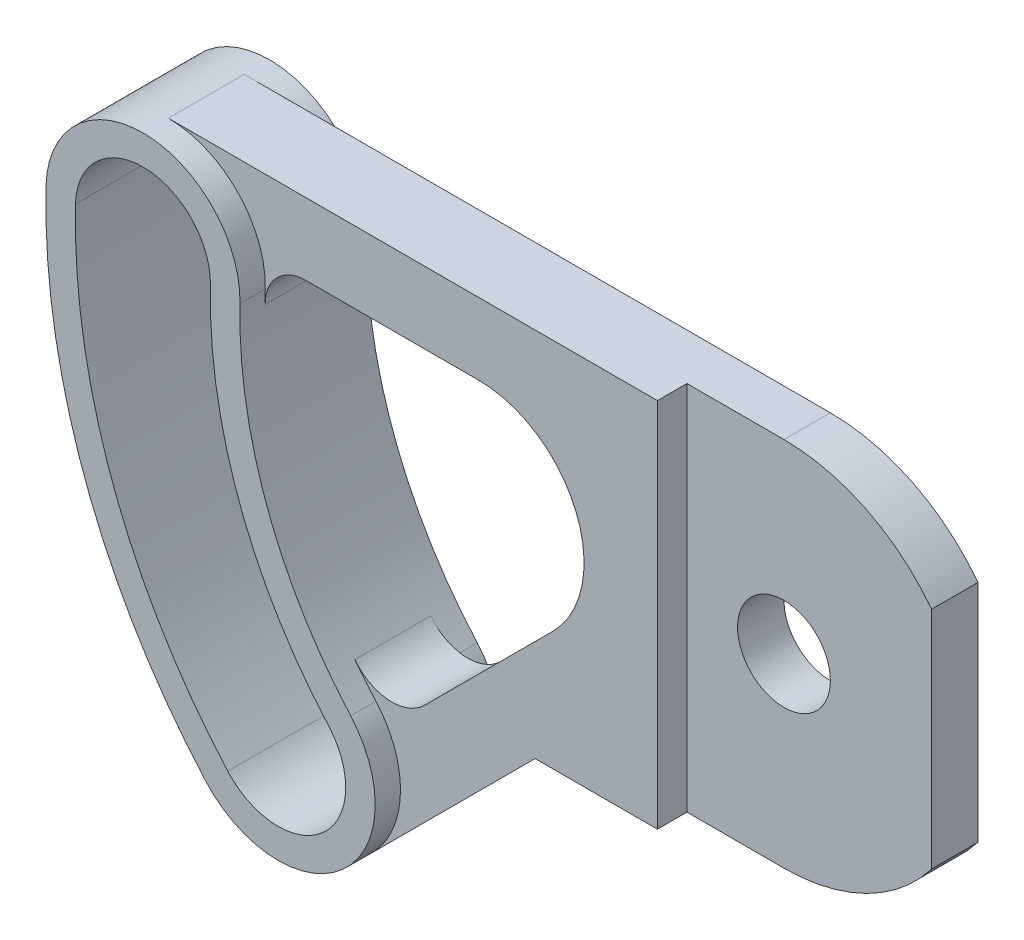
ISO-10303-21;
HEADER;
FILE_DESCRIPTION(('STEP AP214'),'2;1');
FILE_NAME('part.step','',(''),(''),'','','');
FILE_SCHEMA(('AUTOMOTIVE_DESIGN { 1 0 10303 214 1 1 1 1 }'));
ENDSEC;
DATA;
#1=APPLICATION_CONTEXT('core data for automotive mechanical design processes');
#2=APPLICATION_PROTOCOL_DEFINITION('international standard','automotive_design',2000,#1);
#3=PRODUCT_CONTEXT('',#1,'mechanical');
#4=PRODUCT('Part','Part','',(#3));
#5=PRODUCT_RELATED_PRODUCT_CATEGORY('part','',(#4));
#6=PRODUCT_DEFINITION_FORMATION('','',#4);
#7=PRODUCT_DEFINITION_CONTEXT('part definition',#1,'design');
#8=PRODUCT_DEFINITION('design','',#6,#7);
#9=PRODUCT_DEFINITION_SHAPE('','',#8);
#10=(LENGTH_UNIT() NAMED_UNIT(*) SI_UNIT(.MILLI.,.METRE.));
#11=(NAMED_UNIT(*) PLANE_ANGLE_UNIT() SI_UNIT($,.RADIAN.));
#12=(NAMED_UNIT(*) SI_UNIT($,.STERADIAN.) SOLID_ANGLE_UNIT());
#13=UNCERTAINTY_MEASURE_WITH_UNIT(LENGTH_MEASURE(1.E-05),#10,'distance_accuracy_value','');
#14=(GEOMETRIC_REPRESENTATION_CONTEXT(3) GLOBAL_UNCERTAINTY_ASSIGNED_CONTEXT((#13)) GLOBAL_UNIT_ASSIGNED_CONTEXT((#10,
#11,#12)) REPRESENTATION_CONTEXT('',''));
#15=CARTESIAN_POINT('',(0.,0.,0.));
#16=DIRECTION('',(0.,0.,1.));
#17=DIRECTION('',(1.,0.,0.));
#18=AXIS2_PLACEMENT_3D('',#15,#16,#17);
#19=CARTESIAN_POINT('',(-12.,18.,15.));
#20=DIRECTION('',(0.,0.,-1.));
#21=DIRECTION('',(-1.,0.,0.));
#22=AXIS2_PLACEMENT_3D('',#19,#20,#21);
#23=CYLINDRICAL_SURFACE('',#22,150.);
#24=CARTESIAN_POINT('',(-12.,18.,-15.));
#25=DIRECTION('',(0.,0.,1.));
#26=DIRECTION('',(1.,0.,0.));
#27=AXIS2_PLACEMENT_3D('',#24,#25,#26);
#28=CIRCLE('',#27,150.);
#29=CARTESIAN_POINT('',(-161.958144076572,21.5433070866142,-15.));
#30=VERTEX_POINT('',#29);
#31=CARTESIAN_POINT('',(-124.100356479706,-81.6669959270512,-15.));
#32=VERTEX_POINT('',#31);
#33=EDGE_CURVE('E382',#30,#32,#28,.T.);
#34=ORIENTED_EDGE('',*,*,#33,.T.);
#35=DIRECTION('',(0.,0.,-1.));
#36=VECTOR('',#35,1.);
#37=CARTESIAN_POINT('',(-124.100356479706,-81.6669959270512,15.));
#38=LINE('',#37,#36);
#39=CARTESIAN_POINT('',(-124.100356479706,-81.6669959270512,15.));
#40=VERTEX_POINT('',#39);
#41=EDGE_CURVE('E11',#40,#32,#38,.T.);
#42=ORIENTED_EDGE('',*,*,#41,.F.);
#43=CARTESIAN_POINT('',(-12.,18.,15.));
#44=DIRECTION('',(0.,0.,1.));
#45=DIRECTION('',(1.,0.,0.));
#46=AXIS2_PLACEMENT_3D('',#43,#44,#45);
#47=CIRCLE('',#46,150.);
#48=CARTESIAN_POINT('',(-161.958144076572,21.5433070866142,15.));
#49=VERTEX_POINT('',#48);
#50=EDGE_CURVE('E363',#49,#40,#47,.T.);
#51=ORIENTED_EDGE('',*,*,#50,.F.);
#52=DIRECTION('',(0.,0.,-1.));
#53=VECTOR('',#52,1.);
#54=CARTESIAN_POINT('',(-161.958144076572,21.5433070866142,15.));
#55=LINE('',#54,#53);
#56=EDGE_CURVE('E394',#49,#30,#55,.T.);
#57=ORIENTED_EDGE('',*,*,#56,.T.);
#58=EDGE_LOOP('',(#34,#42,#51,#57));
#59=FACE_BOUND('',#58,.T.);
#60=ADVANCED_FACE('F39',(#59),#23,.T.);
#61=CARTESIAN_POINT('',(-106.911635152818,-66.3847232182367,15.));
#62=DIRECTION('',(0.,0.,-1.));
#63=DIRECTION('',(-1.,0.,0.));
#64=AXIS2_PLACEMENT_3D('',#61,#62,#63);
#65=CYLINDRICAL_SURFACE('',#64,23.);
#66=DIRECTION('',(0.,0.,-1.));
#67=VECTOR('',#66,1.);
#68=CARTESIAN_POINT('',(-90.6481791855271,-82.6481791855273,9.));
#69=LINE('',#68,#67);
#70=CARTESIAN_POINT('',(-90.6481791855271,-82.6481791855273,9.));
#71=VERTEX_POINT('',#70);
#72=CARTESIAN_POINT('',(-90.6481791855271,-82.6481791855273,-9.));
#73=VERTEX_POINT('',#72);
#74=EDGE_CURVE('E338',#71,#73,#69,.T.);
#75=ORIENTED_EDGE('',*,*,#74,.F.);
#76=CARTESIAN_POINT('',(-106.911635152818,-66.3847232182367,9.));
#77=DIRECTION('',(0.,0.,1.));
#78=DIRECTION('',(1.,0.,0.));
#79=AXIS2_PLACEMENT_3D('',#76,#77,#78);
#80=CIRCLE('',#79,23.);
#81=CARTESIAN_POINT('',(-89.7229138259295,-51.1024505094222,9.));
#82=VERTEX_POINT('',#81);
#83=EDGE_CURVE('E267',#71,#82,#80,.T.);
#84=ORIENTED_EDGE('',*,*,#83,.T.);
#85=DIRECTION('',(0.,0.,-1.));
#86=VECTOR('',#85,1.);
#87=CARTESIAN_POINT('',(-89.7229138259295,-51.1024505094222,15.));
#88=LINE('',#87,#86);
#89=CARTESIAN_POINT('',(-89.7229138259295,-51.1024505094222,15.));
#90=VERTEX_POINT('',#89);
#91=EDGE_CURVE('E48',#90,#82,#88,.T.);
#92=ORIENTED_EDGE('',*,*,#91,.F.);
#93=CARTESIAN_POINT('',(-106.911635152818,-66.3847232182367,15.));
#94=DIRECTION('',(0.,0.,1.));
#95=DIRECTION('',(1.,0.,0.));
#96=AXIS2_PLACEMENT_3D('',#93,#94,#95);
#97=CIRCLE('',#96,23.);
#98=EDGE_CURVE('E365',#40,#90,#97,.T.);
#99=ORIENTED_EDGE('',*,*,#98,.F.);
#100=ORIENTED_EDGE('',*,*,#41,.T.);
#101=CARTESIAN_POINT('',(-106.911635152818,-66.3847232182367,-15.));
#102=DIRECTION('',(0.,0.,1.));
#103=DIRECTION('',(1.,0.,0.));
#104=AXIS2_PLACEMENT_3D('',#101,#102,#103);
#105=CIRCLE('',#104,23.);
#106=CARTESIAN_POINT('',(-89.7229138259295,-51.1024505094222,-15.));
#107=VERTEX_POINT('',#106);
#108=EDGE_CURVE('E387',#32,#107,#105,.T.);
#109=ORIENTED_EDGE('',*,*,#108,.T.);
#110=CARTESIAN_POINT('',(-89.7229138259295,-51.1024505094222,-9.));
#111=VERTEX_POINT('',#110);
#112=EDGE_CURVE('E398',#111,#107,#88,.T.);
#113=ORIENTED_EDGE('',*,*,#112,.F.);
#114=CARTESIAN_POINT('',(-106.911635152818,-66.3847232182367,-9.));
#115=DIRECTION('',(0.,0.,1.));
#116=DIRECTION('',(1.,0.,0.));
#117=AXIS2_PLACEMENT_3D('',#114,#115,#116);
#118=CIRCLE('',#117,23.);
#119=EDGE_CURVE('E304',#73,#111,#118,.T.);
#120=ORIENTED_EDGE('',*,*,#119,.F.);
#121=EDGE_LOOP('',(#75,#84,#92,#99,#100,#109,#113,#120));
#122=FACE_BOUND('',#121,.T.);
#123=ADVANCED_FACE('F432',(#122),#65,.T.);
#124=CARTESIAN_POINT('',(-12.,18.,15.));
#125=DIRECTION('',(0.,0.,-1.));
#126=DIRECTION('',(-1.,0.,0.));
#127=AXIS2_PLACEMENT_3D('',#124,#125,#126);
#128=CYLINDRICAL_SURFACE('',#127,104.);
#129=CARTESIAN_POINT('',(-12.,18.,9.));
#130=DIRECTION('',(0.,0.,1.));
#131=DIRECTION('',(1.,0.,0.));
#132=AXIS2_PLACEMENT_3D('',#129,#130,#131);
#133=CIRCLE('',#132,104.);
#134=CARTESIAN_POINT('',(-115.97097989309,20.4566929133858,9.));
#135=VERTEX_POINT('',#134);
#136=CARTESIAN_POINT('',(-115.997334395089,17.2553935831425,9.));
#137=VERTEX_POINT('',#136);
#138=EDGE_CURVE('E269',#135,#137,#133,.T.);
#139=ORIENTED_EDGE('',*,*,#138,.F.);
#140=DIRECTION('',(0.,0.,-1.));
#141=VECTOR('',#140,1.);
#142=CARTESIAN_POINT('',(-115.97097989309,20.4566929133858,15.));
#143=LINE('',#142,#141);
#144=CARTESIAN_POINT('',(-115.97097989309,20.4566929133858,15.));
#145=VERTEX_POINT('',#144);
#146=EDGE_CURVE('E400',#145,#135,#143,.T.);
#147=ORIENTED_EDGE('',*,*,#146,.F.);
#148=CARTESIAN_POINT('',(-12.,18.,15.));
#149=DIRECTION('',(0.,0.,1.));
#150=DIRECTION('',(1.,0.,0.));
#151=AXIS2_PLACEMENT_3D('',#148,#149,#150);
#152=CIRCLE('',#151,104.);
#153=EDGE_CURVE('E368',#145,#90,#152,.T.);
#154=ORIENTED_EDGE('',*,*,#153,.T.);
#155=ORIENTED_EDGE('',*,*,#91,.T.);
#156=CARTESIAN_POINT('',(-94.7175715607181,-45.0381103388853,9.));
#157=VERTEX_POINT('',#156);
#158=EDGE_CURVE('E270',#157,#82,#133,.T.);
#159=ORIENTED_EDGE('',*,*,#158,.F.);
#160=DIRECTION('',(0.,0.,-1.));
#161=VECTOR('',#160,1.);
#162=CARTESIAN_POINT('',(-94.7175715607181,-45.0381103388853,9.));
#163=LINE('',#162,#161);
#164=CARTESIAN_POINT('',(-94.7175715607181,-45.0381103388853,-9.));
#165=VERTEX_POINT('',#164);
#166=EDGE_CURVE('E345',#157,#165,#163,.T.);
#167=ORIENTED_EDGE('',*,*,#166,.T.);
#168=CARTESIAN_POINT('',(-12.,18.,-9.));
#169=DIRECTION('',(0.,0.,1.));
#170=DIRECTION('',(1.,0.,0.));
#171=AXIS2_PLACEMENT_3D('',#168,#169,#170);
#172=CIRCLE('',#171,104.);
#173=EDGE_CURVE('E298',#165,#111,#172,.T.);
#174=ORIENTED_EDGE('',*,*,#173,.T.);
#175=ORIENTED_EDGE('',*,*,#112,.T.);
#176=CARTESIAN_POINT('',(-12.,18.,-15.));
#177=DIRECTION('',(0.,0.,1.));
#178=DIRECTION('',(1.,0.,0.));
#179=AXIS2_PLACEMENT_3D('',#176,#177,#178);
#180=CIRCLE('',#179,104.);
#181=CARTESIAN_POINT('',(-115.97097989309,20.4566929133858,-15.));
#182=VERTEX_POINT('',#181);
#183=EDGE_CURVE('E386',#182,#107,#180,.T.);
#184=ORIENTED_EDGE('',*,*,#183,.F.);
#185=CARTESIAN_POINT('',(-115.97097989309,20.4566929133858,-9.));
#186=VERTEX_POINT('',#185);
#187=EDGE_CURVE('E397',#186,#182,#143,.T.);
#188=ORIENTED_EDGE('',*,*,#187,.F.);
#189=CARTESIAN_POINT('',(-115.997334395089,17.2553935831425,-9.));
#190=VERTEX_POINT('',#189);
#191=EDGE_CURVE('E301',#186,#190,#172,.T.);
#192=ORIENTED_EDGE('',*,*,#191,.T.);
#193=DIRECTION('',(0.,0.,-1.));
#194=VECTOR('',#193,1.);
#195=CARTESIAN_POINT('',(-115.997334395089,17.2553935831425,9.));
#196=LINE('',#195,#194);
#197=EDGE_CURVE('E61',#137,#190,#196,.T.);
#198=ORIENTED_EDGE('',*,*,#197,.F.);
#199=EDGE_LOOP('',(#139,#147,#154,#155,#159,#167,#174,#175,#184,#188,#192,#198));
#200=FACE_BOUND('',#199,.T.);
#201=ADVANCED_FACE('F442',(#200),#128,.F.);
#202=CARTESIAN_POINT('',(-138.964561984831,21.,15.));
#203=DIRECTION('',(0.,0.,-1.));
#204=DIRECTION('',(-1.,0.,0.));
#205=AXIS2_PLACEMENT_3D('',#202,#203,#204);
#206=CYLINDRICAL_SURFACE('',#205,16.);
#207=CARTESIAN_POINT('',(-138.964561984831,21.,-15.));
#208=DIRECTION('',(0.,0.,1.));
#209=DIRECTION('',(1.,0.,0.));
#210=AXIS2_PLACEMENT_3D('',#207,#208,#209);
#211=CIRCLE('',#210,16.);
#212=CARTESIAN_POINT('',(-122.969026616663,20.6220472440945,-15.));
#213=VERTEX_POINT('',#212);
#214=CARTESIAN_POINT('',(-154.960097352999,21.3779527559055,-15.));
#215=VERTEX_POINT('',#214);
#216=EDGE_CURVE('E346',#213,#215,#211,.T.);
#217=ORIENTED_EDGE('',*,*,#216,.F.);
#218=DIRECTION('',(0.,0.,-1.));
#219=VECTOR('',#218,1.);
#220=CARTESIAN_POINT('',(-122.969026616663,20.6220472440945,15.));
#221=LINE('',#220,#219);
#222=CARTESIAN_POINT('',(-122.969026616663,20.6220472440945,15.));
#223=VERTEX_POINT('',#222);
#224=EDGE_CURVE('E43',#223,#213,#221,.T.);
#225=ORIENTED_EDGE('',*,*,#224,.F.);
#226=CARTESIAN_POINT('',(-138.964561984831,21.,15.));
#227=DIRECTION('',(0.,0.,1.));
#228=DIRECTION('',(1.,0.,0.));
#229=AXIS2_PLACEMENT_3D('',#226,#227,#228);
#230=CIRCLE('',#229,16.);
#231=CARTESIAN_POINT('',(-154.960097352999,21.3779527559055,15.));
#232=VERTEX_POINT('',#231);
#233=EDGE_CURVE('E349',#223,#232,#230,.T.);
#234=ORIENTED_EDGE('',*,*,#233,.T.);
#235=DIRECTION('',(0.,0.,-1.));
#236=VECTOR('',#235,1.);
#237=CARTESIAN_POINT('',(-154.960097352999,21.3779527559055,15.));
#238=LINE('',#237,#236);
#239=EDGE_CURVE('E371',#232,#215,#238,.T.);
#240=ORIENTED_EDGE('',*,*,#239,.T.);
#241=EDGE_LOOP('',(#217,#225,#234,#240));
#242=FACE_BOUND('',#241,.T.);
#243=ADVANCED_FACE('F41',(#242),#206,.F.);
#244=CARTESIAN_POINT('',(-12.,18.,15.));
#245=DIRECTION('',(0.,0.,-1.));
#246=DIRECTION('',(-1.,0.,0.));
#247=AXIS2_PLACEMENT_3D('',#244,#245,#246);
#248=CYLINDRICAL_SURFACE('',#247,111.);
#249=CARTESIAN_POINT('',(-12.,18.,-15.));
#250=DIRECTION('',(0.,0.,1.));
#251=DIRECTION('',(1.,0.,0.));
#252=AXIS2_PLACEMENT_3D('',#249,#250,#251);
#253=CIRCLE('',#252,111.);
#254=CARTESIAN_POINT('',(-94.9542637949824,-55.7535769860179,-15.));
#255=VERTEX_POINT('',#254);
#256=EDGE_CURVE('E372',#213,#255,#253,.T.);
#257=ORIENTED_EDGE('',*,*,#256,.T.);
#258=DIRECTION('',(0.,0.,-1.));
#259=VECTOR('',#258,1.);
#260=CARTESIAN_POINT('',(-94.9542637949824,-55.7535769860179,15.));
#261=LINE('',#260,#259);
#262=CARTESIAN_POINT('',(-94.9542637949824,-55.7535769860179,15.));
#263=VERTEX_POINT('',#262);
#264=EDGE_CURVE('E403',#263,#255,#261,.T.);
#265=ORIENTED_EDGE('',*,*,#264,.F.);
#266=CARTESIAN_POINT('',(-12.,18.,15.));
#267=DIRECTION('',(0.,0.,1.));
#268=DIRECTION('',(1.,0.,0.));
#269=AXIS2_PLACEMENT_3D('',#266,#267,#268);
#270=CIRCLE('',#269,111.);
#271=EDGE_CURVE('E355',#223,#263,#270,.T.);
#272=ORIENTED_EDGE('',*,*,#271,.F.);
#273=ORIENTED_EDGE('',*,*,#224,.T.);
#274=EDGE_LOOP('',(#257,#265,#272,#273));
#275=FACE_BOUND('',#274,.T.);
#276=ADVANCED_FACE('F415',(#275),#248,.T.);
#277=CARTESIAN_POINT('',(-106.911635152818,-66.3847232182367,15.));
#278=DIRECTION('',(0.,0.,-1.));
#279=DIRECTION('',(-1.,0.,0.));
#280=AXIS2_PLACEMENT_3D('',#277,#278,#279);
#281=CYLINDRICAL_SURFACE('',#280,16.);
#282=CARTESIAN_POINT('',(-106.911635152818,-66.3847232182367,-15.));
#283=DIRECTION('',(0.,0.,1.));
#284=DIRECTION('',(1.,0.,0.));
#285=AXIS2_PLACEMENT_3D('',#282,#283,#284);
#286=CIRCLE('',#285,16.);
#287=CARTESIAN_POINT('',(-118.869006510653,-77.0158694504554,-15.));
#288=VERTEX_POINT('',#287);
#289=EDGE_CURVE('E380',#288,#255,#286,.T.);
#290=ORIENTED_EDGE('',*,*,#289,.F.);
#291=DIRECTION('',(0.,0.,-1.));
#292=VECTOR('',#291,1.);
#293=CARTESIAN_POINT('',(-118.869006510653,-77.0158694504554,15.));
#294=LINE('',#293,#292);
#295=CARTESIAN_POINT('',(-118.869006510653,-77.0158694504554,15.));
#296=VERTEX_POINT('',#295);
#297=EDGE_CURVE('E404',#296,#288,#294,.T.);
#298=ORIENTED_EDGE('',*,*,#297,.F.);
#299=CARTESIAN_POINT('',(-106.911635152818,-66.3847232182367,15.));
#300=DIRECTION('',(0.,0.,1.));
#301=DIRECTION('',(1.,0.,0.));
#302=AXIS2_PLACEMENT_3D('',#299,#300,#301);
#303=CIRCLE('',#302,16.);
#304=EDGE_CURVE('E353',#296,#263,#303,.T.);
#305=ORIENTED_EDGE('',*,*,#304,.T.);
#306=ORIENTED_EDGE('',*,*,#264,.T.);
#307=EDGE_LOOP('',(#290,#298,#305,#306));
#308=FACE_BOUND('',#307,.T.);
#309=ADVANCED_FACE('F424',(#308),#281,.F.);
#310=CARTESIAN_POINT('',(-12.,18.,15.));
#311=DIRECTION('',(0.,0.,-1.));
#312=DIRECTION('',(-1.,0.,0.));
#313=AXIS2_PLACEMENT_3D('',#310,#311,#312);
#314=CYLINDRICAL_SURFACE('',#313,143.);
#315=CARTESIAN_POINT('',(-12.,18.,-15.));
#316=DIRECTION('',(0.,0.,1.));
#317=DIRECTION('',(1.,0.,0.));
#318=AXIS2_PLACEMENT_3D('',#315,#316,#317);
#319=CIRCLE('',#318,143.);
#320=EDGE_CURVE('E379',#215,#288,#319,.T.);
#321=ORIENTED_EDGE('',*,*,#320,.F.);
#322=ORIENTED_EDGE('',*,*,#239,.F.);
#323=CARTESIAN_POINT('',(-12.,18.,15.));
#324=DIRECTION('',(0.,0.,1.));
#325=DIRECTION('',(1.,0.,0.));
#326=AXIS2_PLACEMENT_3D('',#323,#324,#325);
#327=CIRCLE('',#326,143.);
#328=EDGE_CURVE('E359',#232,#296,#327,.T.);
#329=ORIENTED_EDGE('',*,*,#328,.T.);
#330=ORIENTED_EDGE('',*,*,#297,.T.);
#331=EDGE_LOOP('',(#321,#322,#329,#330));
#332=FACE_BOUND('',#331,.T.);
#333=ADVANCED_FACE('F425',(#332),#314,.F.);
#334=CARTESIAN_POINT('',(-138.964561984831,21.,15.));
#335=DIRECTION('',(0.,0.,-1.));
#336=DIRECTION('',(-1.,0.,0.));
#337=AXIS2_PLACEMENT_3D('',#334,#335,#336);
#338=CYLINDRICAL_SURFACE('',#337,23.);
#339=ORIENTED_EDGE('',*,*,#146,.T.);
#340=CARTESIAN_POINT('',(-138.964561984831,21.,9.));
#341=DIRECTION('',(0.,0.,1.));
#342=DIRECTION('',(1.,0.,0.));
#343=AXIS2_PLACEMENT_3D('',#340,#341,#342);
#344=CIRCLE('',#343,23.);
#345=CARTESIAN_POINT('',(-138.964561984831,44.,9.));
#346=VERTEX_POINT('',#345);
#347=EDGE_CURVE('E283',#135,#346,#344,.T.);
#348=ORIENTED_EDGE('',*,*,#347,.T.);
#349=DIRECTION('',(0.,0.,-1.));
#350=VECTOR('',#349,1.);
#351=CARTESIAN_POINT('',(-138.964561984831,44.,9.));
#352=LINE('',#351,#350);
#353=CARTESIAN_POINT('',(-138.964561984831,44.,-9.));
#354=VERTEX_POINT('',#353);
#355=EDGE_CURVE('E335',#346,#354,#352,.T.);
#356=ORIENTED_EDGE('',*,*,#355,.T.);
#357=CARTESIAN_POINT('',(-138.964561984831,21.,-9.));
#358=DIRECTION('',(0.,0.,1.));
#359=DIRECTION('',(1.,0.,0.));
#360=AXIS2_PLACEMENT_3D('',#357,#358,#359);
#361=CIRCLE('',#360,23.);
#362=EDGE_CURVE('E312',#186,#354,#361,.T.);
#363=ORIENTED_EDGE('',*,*,#362,.F.);
#364=ORIENTED_EDGE('',*,*,#187,.T.);
#365=CARTESIAN_POINT('',(-138.964561984831,21.,-15.));
#366=DIRECTION('',(0.,0.,1.));
#367=DIRECTION('',(1.,0.,0.));
#368=AXIS2_PLACEMENT_3D('',#365,#366,#367);
#369=CIRCLE('',#368,23.);
#370=EDGE_CURVE('E354',#182,#30,#369,.T.);
#371=ORIENTED_EDGE('',*,*,#370,.T.);
#372=ORIENTED_EDGE('',*,*,#56,.F.);
#373=CARTESIAN_POINT('',(-138.964561984831,21.,15.));
#374=DIRECTION('',(0.,0.,1.));
#375=DIRECTION('',(1.,0.,0.));
#376=AXIS2_PLACEMENT_3D('',#373,#374,#375);
#377=CIRCLE('',#376,23.);
#378=EDGE_CURVE('E369',#145,#49,#377,.T.);
#379=ORIENTED_EDGE('',*,*,#378,.F.);
#380=EDGE_LOOP('',(#339,#348,#356,#363,#364,#371,#372,#379));
#381=FACE_BOUND('',#380,.T.);
#382=ADVANCED_FACE('F431',(#381),#338,.T.);
#383=CARTESIAN_POINT('',(0.,0.,15.));
#384=DIRECTION('',(0.,0.,1.));
#385=DIRECTION('',(1.,0.,0.));
#386=AXIS2_PLACEMENT_3D('',#383,#384,#385);
#387=PLANE('',#386);
#388=ORIENTED_EDGE('',*,*,#233,.F.);
#389=ORIENTED_EDGE('',*,*,#271,.T.);
#390=ORIENTED_EDGE('',*,*,#304,.F.);
#391=ORIENTED_EDGE('',*,*,#328,.F.);
#392=EDGE_LOOP('',(#388,#389,#390,#391));
#393=FACE_BOUND('',#392,.T.);
#394=ORIENTED_EDGE('',*,*,#50,.T.);
#395=ORIENTED_EDGE('',*,*,#98,.T.);
#396=ORIENTED_EDGE('',*,*,#153,.F.);
#397=ORIENTED_EDGE('',*,*,#378,.T.);
#398=EDGE_LOOP('',(#394,#395,#396,#397));
#399=FACE_BOUND('',#398,.T.);
#400=ADVANCED_FACE('F446',(#393,#399),#387,.T.);
#401=CARTESIAN_POINT('',(0.,0.,-15.));
#402=DIRECTION('',(0.,0.,1.));
#403=DIRECTION('',(1.,0.,0.));
#404=AXIS2_PLACEMENT_3D('',#401,#402,#403);
#405=PLANE('',#404);
#406=ORIENTED_EDGE('',*,*,#216,.T.);
#407=ORIENTED_EDGE('',*,*,#320,.T.);
#408=ORIENTED_EDGE('',*,*,#289,.T.);
#409=ORIENTED_EDGE('',*,*,#256,.F.);
#410=EDGE_LOOP('',(#406,#407,#408,#409));
#411=FACE_BOUND('',#410,.T.);
#412=ORIENTED_EDGE('',*,*,#33,.F.);
#413=ORIENTED_EDGE('',*,*,#370,.F.);
#414=ORIENTED_EDGE('',*,*,#183,.T.);
#415=ORIENTED_EDGE('',*,*,#108,.F.);
#416=EDGE_LOOP('',(#412,#413,#414,#415));
#417=FACE_BOUND('',#416,.T.);
#418=ADVANCED_FACE('F417',(#411,#417),#405,.F.);
#419=CARTESIAN_POINT('',(-16.0208152801714,16.0208152801714,9.));
#420=DIRECTION('',(0.707106781186549,-0.707106781186546,0.));
#421=DIRECTION('',(0.707106781186546,0.707106781186549,0.));
#422=AXIS2_PLACEMENT_3D('',#419,#420,#421);
#423=PLANE('',#422);
#424=DIRECTION('',(-0.707106781186546,-0.707106781186549,0.));
#425=VECTOR('',#424,1.);
#426=CARTESIAN_POINT('',(-16.0208152801714,16.0208152801714,-9.));
#427=LINE('',#426,#425);
#428=CARTESIAN_POINT('',(-47.7193000900063,-15.6776695296637,-9.));
#429=VERTEX_POINT('',#428);
#430=CARTESIAN_POINT('',(-78.1904230525901,-46.1487924922476,-9.));
#431=VERTEX_POINT('',#430);
#432=EDGE_CURVE('E217',#429,#431,#427,.T.);
#433=ORIENTED_EDGE('',*,*,#432,.T.);
#434=DIRECTION('',(0.,0.,-1.));
#435=VECTOR('',#434,1.);
#436=CARTESIAN_POINT('',(-78.1904230525901,-46.1487924922476,9.));
#437=LINE('',#436,#435);
#438=CARTESIAN_POINT('',(-78.1904230525901,-46.1487924922476,9.));
#439=VERTEX_POINT('',#438);
#440=EDGE_CURVE('E343',#439,#431,#437,.T.);
#441=ORIENTED_EDGE('',*,*,#440,.F.);
#442=DIRECTION('',(-0.707106781186546,-0.707106781186549,0.));
#443=VECTOR('',#442,1.);
#444=CARTESIAN_POINT('',(-16.0208152801714,16.0208152801714,9.));
#445=LINE('',#444,#443);
#446=CARTESIAN_POINT('',(-47.7193000900063,-15.6776695296637,9.));
#447=VERTEX_POINT('',#446);
#448=EDGE_CURVE('E261',#447,#439,#445,.T.);
#449=ORIENTED_EDGE('',*,*,#448,.F.);
#450=DIRECTION('',(0.,0.,-1.));
#451=VECTOR('',#450,1.);
#452=CARTESIAN_POINT('',(-47.7193000900063,-15.6776695296637,9.));
#453=LINE('',#452,#451);
#454=EDGE_CURVE('E293',#447,#429,#453,.T.);
#455=ORIENTED_EDGE('',*,*,#454,.T.);
#456=EDGE_LOOP('',(#433,#441,#449,#455));
#457=FACE_BOUND('',#456,.T.);
#458=ADVANCED_FACE('F454',(#457),#423,.F.);
#459=CARTESIAN_POINT('',(-85.9685976456421,-38.3706178991956,9.));
#460=DIRECTION('',(0.,0.,-1.));
#461=DIRECTION('',(-1.,0.,0.));
#462=AXIS2_PLACEMENT_3D('',#459,#460,#461);
#463=CYLINDRICAL_SURFACE('',#462,11.);
#464=CARTESIAN_POINT('',(-85.9685976456421,-38.3706178991956,-9.));
#465=DIRECTION('',(0.,0.,1.));
#466=DIRECTION('',(1.,0.,0.));
#467=AXIS2_PLACEMENT_3D('',#464,#465,#466);
#468=CIRCLE('',#467,11.);
#469=EDGE_CURVE('E299',#431,#165,#468,.F.);
#470=ORIENTED_EDGE('',*,*,#469,.T.);
#471=ORIENTED_EDGE('',*,*,#166,.F.);
#472=CARTESIAN_POINT('',(-85.9685976456421,-38.3706178991956,9.));
#473=DIRECTION('',(0.,0.,1.));
#474=DIRECTION('',(1.,0.,0.));
#475=AXIS2_PLACEMENT_3D('',#472,#473,#474);
#476=CIRCLE('',#475,11.);
#477=EDGE_CURVE('E262',#439,#157,#476,.F.);
#478=ORIENTED_EDGE('',*,*,#477,.F.);
#479=ORIENTED_EDGE('',*,*,#440,.T.);
#480=EDGE_LOOP('',(#470,#471,#478,#479));
#481=FACE_BOUND('',#480,.T.);
#482=ADVANCED_FACE('F459',(#481),#463,.F.);
#483=CARTESIAN_POINT('',(-4.00000000000009,4.00000000000008,9.));
#484=DIRECTION('',(0.707106781186549,-0.707106781186546,0.));
#485=DIRECTION('',(0.707106781186546,0.707106781186549,0.));
#486=AXIS2_PLACEMENT_3D('',#483,#484,#485);
#487=PLANE('',#486);
#488=DIRECTION('',(-0.707106781186546,-0.707106781186549,0.));
#489=VECTOR('',#488,1.);
#490=CARTESIAN_POINT('',(-4.00000000000009,4.00000000000008,-9.));
#491=LINE('',#490,#489);
#492=CARTESIAN_POINT('',(-52.,-44.,-9.));
#493=VERTEX_POINT('',#492);
#494=EDGE_CURVE('E308',#493,#73,#491,.T.);
#495=ORIENTED_EDGE('',*,*,#494,.F.);
#496=DIRECTION('',(0.,0.,-1.));
#497=VECTOR('',#496,1.);
#498=CARTESIAN_POINT('',(-52.,-44.,9.));
#499=LINE('',#498,#497);
#500=CARTESIAN_POINT('',(-52.,-44.,9.));
#501=VERTEX_POINT('',#500);
#502=EDGE_CURVE('E339',#501,#493,#499,.T.);
#503=ORIENTED_EDGE('',*,*,#502,.F.);
#504=DIRECTION('',(-0.707106781186546,-0.707106781186549,0.));
#505=VECTOR('',#504,1.);
#506=CARTESIAN_POINT('',(-4.00000000000009,4.00000000000008,9.));
#507=LINE('',#506,#505);
#508=EDGE_CURVE('E272',#501,#71,#507,.T.);
#509=ORIENTED_EDGE('',*,*,#508,.T.);
#510=ORIENTED_EDGE('',*,*,#74,.T.);
#511=EDGE_LOOP('',(#495,#503,#509,#510));
#512=FACE_BOUND('',#511,.T.);
#513=ADVANCED_FACE('F464',(#512),#487,.T.);
#514=CARTESIAN_POINT('',(0.,-44.,9.));
#515=DIRECTION('',(0.,-1.,0.));
#516=DIRECTION('',(1.,0.,0.));
#517=AXIS2_PLACEMENT_3D('',#514,#515,#516);
#518=PLANE('',#517);
#519=DIRECTION('',(-1.,0.,0.));
#520=VECTOR('',#519,1.);
#521=CARTESIAN_POINT('',(0.,-44.,-9.));
#522=LINE('',#521,#520);
#523=CARTESIAN_POINT('',(0.,-44.,-9.));
#524=VERTEX_POINT('',#523);
#525=EDGE_CURVE('E310',#524,#493,#522,.T.);
#526=ORIENTED_EDGE('',*,*,#525,.F.);
#527=DIRECTION('',(0.,0.,-1.));
#528=VECTOR('',#527,1.);
#529=CARTESIAN_POINT('',(0.,-44.,2.));
#530=LINE('',#529,#528);
#531=CARTESIAN_POINT('',(0.,-44.,2.));
#532=VERTEX_POINT('',#531);
#533=EDGE_CURVE('E260',#532,#524,#530,.T.);
#534=ORIENTED_EDGE('',*,*,#533,.F.);
#535=DIRECTION('',(-1.,0.,0.));
#536=VECTOR('',#535,1.);
#537=CARTESIAN_POINT('',(0.,-44.,2.));
#538=LINE('',#537,#536);
#539=CARTESIAN_POINT('',(-23.,-44.,2.));
#540=VERTEX_POINT('',#539);
#541=EDGE_CURVE('E244',#532,#540,#538,.T.);
#542=ORIENTED_EDGE('',*,*,#541,.T.);
#543=DIRECTION('',(0.,0.,-1.));
#544=VECTOR('',#543,1.);
#545=CARTESIAN_POINT('',(-23.,-44.,9.));
#546=LINE('',#545,#544);
#547=CARTESIAN_POINT('',(-23.,-44.,9.));
#548=VERTEX_POINT('',#547);
#549=EDGE_CURVE('E337',#548,#540,#546,.T.);
#550=ORIENTED_EDGE('',*,*,#549,.F.);
#551=DIRECTION('',(-1.,0.,0.));
#552=VECTOR('',#551,1.);
#553=CARTESIAN_POINT('',(0.,-44.,9.));
#554=LINE('',#553,#552);
#555=EDGE_CURVE('E277',#548,#501,#554,.T.);
#556=ORIENTED_EDGE('',*,*,#555,.T.);
#557=ORIENTED_EDGE('',*,*,#502,.T.);
#558=EDGE_LOOP('',(#526,#534,#542,#550,#556,#557));
#559=FACE_BOUND('',#558,.T.);
#560=ADVANCED_FACE('F470',(#559),#518,.T.);
#561=CARTESIAN_POINT('',(-23.,0.,9.));
#562=DIRECTION('',(1.,0.,0.));
#563=DIRECTION('',(0.,0.,-1.));
#564=AXIS2_PLACEMENT_3D('',#561,#562,#563);
#565=PLANE('',#564);
#566=DIRECTION('',(0.,-1.,0.));
#567=VECTOR('',#566,1.);
#568=CARTESIAN_POINT('',(-23.,0.,2.));
#569=LINE('',#568,#567);
#570=CARTESIAN_POINT('',(-23.,44.,2.));
#571=VERTEX_POINT('',#570);
#572=EDGE_CURVE('E57',#571,#540,#569,.T.);
#573=ORIENTED_EDGE('',*,*,#572,.F.);
#574=DIRECTION('',(0.,0.,-1.));
#575=VECTOR('',#574,1.);
#576=CARTESIAN_POINT('',(-23.,44.,9.));
#577=LINE('',#576,#575);
#578=CARTESIAN_POINT('',(-23.,44.,9.));
#579=VERTEX_POINT('',#578);
#580=EDGE_CURVE('E331',#579,#571,#577,.T.);
#581=ORIENTED_EDGE('',*,*,#580,.F.);
#582=DIRECTION('',(0.,-1.,0.));
#583=VECTOR('',#582,1.);
#584=CARTESIAN_POINT('',(-23.,0.,9.));
#585=LINE('',#584,#583);
#586=EDGE_CURVE('E276',#579,#548,#585,.T.);
#587=ORIENTED_EDGE('',*,*,#586,.T.);
#588=ORIENTED_EDGE('',*,*,#549,.T.);
#589=EDGE_LOOP('',(#573,#581,#587,#588));
#590=FACE_BOUND('',#589,.T.);
#591=ADVANCED_FACE('F473',(#590),#565,.T.);
#592=CARTESIAN_POINT('',(0.,44.,9.));
#593=DIRECTION('',(0.,-1.,0.));
#594=DIRECTION('',(1.,0.,0.));
#595=AXIS2_PLACEMENT_3D('',#592,#593,#594);
#596=PLANE('',#595);
#597=DIRECTION('',(-1.,0.,0.));
#598=VECTOR('',#597,1.);
#599=CARTESIAN_POINT('',(0.,44.,-9.));
#600=LINE('',#599,#598);
#601=CARTESIAN_POINT('',(0.,44.,-9.));
#602=VERTEX_POINT('',#601);
#603=EDGE_CURVE('E315',#602,#354,#600,.T.);
#604=ORIENTED_EDGE('',*,*,#603,.T.);
#605=ORIENTED_EDGE('',*,*,#355,.F.);
#606=DIRECTION('',(-1.,0.,0.));
#607=VECTOR('',#606,1.);
#608=CARTESIAN_POINT('',(0.,44.,9.));
#609=LINE('',#608,#607);
#610=EDGE_CURVE('E285',#579,#346,#609,.T.);
#611=ORIENTED_EDGE('',*,*,#610,.F.);
#612=ORIENTED_EDGE('',*,*,#580,.T.);
#613=DIRECTION('',(-1.,0.,0.));
#614=VECTOR('',#613,1.);
#615=CARTESIAN_POINT('',(0.,44.,2.));
#616=LINE('',#615,#614);
#617=CARTESIAN_POINT('',(0.,44.,2.));
#618=VERTEX_POINT('',#617);
#619=EDGE_CURVE('E229',#618,#571,#616,.T.);
#620=ORIENTED_EDGE('',*,*,#619,.F.);
#621=DIRECTION('',(0.,0.,-1.));
#622=VECTOR('',#621,1.);
#623=CARTESIAN_POINT('',(0.,44.,2.));
#624=LINE('',#623,#622);
#625=EDGE_CURVE('E218',#618,#602,#624,.T.);
#626=ORIENTED_EDGE('',*,*,#625,.T.);
#627=EDGE_LOOP('',(#604,#605,#611,#612,#620,#626));
#628=FACE_BOUND('',#627,.T.);
#629=ADVANCED_FACE('F474',(#628),#596,.F.);
#630=CARTESIAN_POINT('',(-106.322248233141,17.324665851338,9.));
#631=DIRECTION('',(0.,0.,-1.));
#632=DIRECTION('',(-1.,0.,0.));
#633=AXIS2_PLACEMENT_3D('',#630,#631,#632);
#634=CYLINDRICAL_SURFACE('',#633,9.67533414866198);
#635=CARTESIAN_POINT('',(-106.322248233141,17.324665851338,-9.));
#636=DIRECTION('',(0.,0.,1.));
#637=DIRECTION('',(1.,0.,0.));
#638=AXIS2_PLACEMENT_3D('',#635,#636,#637);
#639=CIRCLE('',#638,9.67533414866198);
#640=CARTESIAN_POINT('',(-106.322248233141,27.,-9.));
#641=VERTEX_POINT('',#640);
#642=EDGE_CURVE('E318',#641,#190,#639,.T.);
#643=ORIENTED_EDGE('',*,*,#642,.F.);
#644=DIRECTION('',(0.,0.,-1.));
#645=VECTOR('',#644,1.);
#646=CARTESIAN_POINT('',(-106.322248233141,27.,9.));
#647=LINE('',#646,#645);
#648=CARTESIAN_POINT('',(-106.322248233141,27.,9.));
#649=VERTEX_POINT('',#648);
#650=EDGE_CURVE('E328',#649,#641,#647,.T.);
#651=ORIENTED_EDGE('',*,*,#650,.F.);
#652=CARTESIAN_POINT('',(-106.322248233141,17.324665851338,9.));
#653=DIRECTION('',(0.,0.,1.));
#654=DIRECTION('',(1.,0.,0.));
#655=AXIS2_PLACEMENT_3D('',#652,#653,#654);
#656=CIRCLE('',#655,9.67533414866198);
#657=EDGE_CURVE('E290',#649,#137,#656,.T.);
#658=ORIENTED_EDGE('',*,*,#657,.T.);
#659=ORIENTED_EDGE('',*,*,#197,.T.);
#660=EDGE_LOOP('',(#643,#651,#658,#659));
#661=FACE_BOUND('',#660,.T.);
#662=ADVANCED_FACE('F476',(#661),#634,.F.);
#663=CARTESIAN_POINT('',(0.,27.,9.));
#664=DIRECTION('',(0.,-1.,0.));
#665=DIRECTION('',(1.,0.,0.));
#666=AXIS2_PLACEMENT_3D('',#663,#664,#665);
#667=PLANE('',#666);
#668=DIRECTION('',(-1.,0.,0.));
#669=VECTOR('',#668,1.);
#670=CARTESIAN_POINT('',(0.,27.,-9.));
#671=LINE('',#670,#669);
#672=CARTESIAN_POINT('',(-65.3969696196701,27.,-9.));
#673=VERTEX_POINT('',#672);
#674=EDGE_CURVE('E321',#673,#641,#671,.T.);
#675=ORIENTED_EDGE('',*,*,#674,.F.);
#676=DIRECTION('',(0.,0.,-1.));
#677=VECTOR('',#676,1.);
#678=CARTESIAN_POINT('',(-65.3969696196701,27.,9.));
#679=LINE('',#678,#677);
#680=CARTESIAN_POINT('',(-65.3969696196701,27.,9.));
#681=VERTEX_POINT('',#680);
#682=EDGE_CURVE('E330',#681,#673,#679,.T.);
#683=ORIENTED_EDGE('',*,*,#682,.F.);
#684=DIRECTION('',(-1.,0.,0.));
#685=VECTOR('',#684,1.);
#686=CARTESIAN_POINT('',(0.,27.,9.));
#687=LINE('',#686,#685);
#688=EDGE_CURVE('E288',#681,#649,#687,.T.);
#689=ORIENTED_EDGE('',*,*,#688,.T.);
#690=ORIENTED_EDGE('',*,*,#650,.T.);
#691=EDGE_LOOP('',(#675,#683,#689,#690));
#692=FACE_BOUND('',#691,.T.);
#693=ADVANCED_FACE('F485',(#692),#667,.T.);
#694=CARTESIAN_POINT('',(-65.3969696196701,1.99999999999999,9.));
#695=DIRECTION('',(0.,0.,-1.));
#696=DIRECTION('',(-1.,0.,0.));
#697=AXIS2_PLACEMENT_3D('',#694,#695,#696);
#698=CYLINDRICAL_SURFACE('',#697,25.);
#699=CARTESIAN_POINT('',(-65.3969696196701,1.99999999999999,-9.));
#700=DIRECTION('',(0.,0.,1.));
#701=DIRECTION('',(1.,0.,0.));
#702=AXIS2_PLACEMENT_3D('',#699,#700,#701);
#703=CIRCLE('',#702,25.);
#704=EDGE_CURVE('E264',#673,#429,#703,.F.);
#705=ORIENTED_EDGE('',*,*,#704,.T.);
#706=ORIENTED_EDGE('',*,*,#454,.F.);
#707=CARTESIAN_POINT('',(-65.3969696196701,1.99999999999999,9.));
#708=DIRECTION('',(0.,0.,1.));
#709=DIRECTION('',(1.,0.,0.));
#710=AXIS2_PLACEMENT_3D('',#707,#708,#709);
#711=CIRCLE('',#710,25.);
#712=EDGE_CURVE('E291',#681,#447,#711,.F.);
#713=ORIENTED_EDGE('',*,*,#712,.F.);
#714=ORIENTED_EDGE('',*,*,#682,.T.);
#715=EDGE_LOOP('',(#705,#706,#713,#714));
#716=FACE_BOUND('',#715,.T.);
#717=ADVANCED_FACE('F486',(#716),#698,.F.);
#718=CARTESIAN_POINT('',(0.,0.,9.));
#719=DIRECTION('',(0.,0.,1.));
#720=DIRECTION('',(1.,0.,0.));
#721=AXIS2_PLACEMENT_3D('',#718,#719,#720);
#722=PLANE('',#721);
#723=ORIENTED_EDGE('',*,*,#448,.T.);
#724=ORIENTED_EDGE('',*,*,#477,.T.);
#725=ORIENTED_EDGE('',*,*,#158,.T.);
#726=ORIENTED_EDGE('',*,*,#83,.F.);
#727=ORIENTED_EDGE('',*,*,#508,.F.);
#728=ORIENTED_EDGE('',*,*,#555,.F.);
#729=ORIENTED_EDGE('',*,*,#586,.F.);
#730=ORIENTED_EDGE('',*,*,#610,.T.);
#731=ORIENTED_EDGE('',*,*,#347,.F.);
#732=ORIENTED_EDGE('',*,*,#138,.T.);
#733=ORIENTED_EDGE('',*,*,#657,.F.);
#734=ORIENTED_EDGE('',*,*,#688,.F.);
#735=ORIENTED_EDGE('',*,*,#712,.T.);
#736=EDGE_LOOP('',(#723,#724,#725,#726,#727,#728,#729,#730,#731,#732,#733,#734,#735));
#737=FACE_BOUND('',#736,.T.);
#738=ADVANCED_FACE('F489',(#737),#722,.T.);
#739=CARTESIAN_POINT('',(0.,0.,-9.));
#740=DIRECTION('',(0.,0.,1.));
#741=DIRECTION('',(1.,0.,0.));
#742=AXIS2_PLACEMENT_3D('',#739,#740,#741);
#743=PLANE('',#742);
#744=ORIENTED_EDGE('',*,*,#432,.F.);
#745=ORIENTED_EDGE('',*,*,#704,.F.);
#746=ORIENTED_EDGE('',*,*,#674,.T.);
#747=ORIENTED_EDGE('',*,*,#642,.T.);
#748=ORIENTED_EDGE('',*,*,#191,.F.);
#749=ORIENTED_EDGE('',*,*,#362,.T.);
#750=ORIENTED_EDGE('',*,*,#603,.F.);
#751=CARTESIAN_POINT('',(0.,0.,-9.));
#752=DIRECTION('',(0.,0.,1.));
#753=DIRECTION('',(1.,0.,0.));
#754=AXIS2_PLACEMENT_3D('',#751,#752,#753);
#755=CIRCLE('',#754,44.);
#756=CARTESIAN_POINT('',(35.,26.6645832519468,-9.));
#757=VERTEX_POINT('',#756);
#758=EDGE_CURVE('E252',#757,#602,#755,.T.);
#759=ORIENTED_EDGE('',*,*,#758,.F.);
#760=DIRECTION('',(0.,-1.,0.));
#761=VECTOR('',#760,1.);
#762=CARTESIAN_POINT('',(35.,0.,-9.));
#763=LINE('',#762,#761);
#764=CARTESIAN_POINT('',(35.,-26.6645832519468,-9.));
#765=VERTEX_POINT('',#764);
#766=EDGE_CURVE('E212',#757,#765,#763,.T.);
#767=ORIENTED_EDGE('',*,*,#766,.T.);
#768=CARTESIAN_POINT('',(0.,0.,-9.));
#769=DIRECTION('',(0.,0.,1.));
#770=DIRECTION('',(1.,0.,0.));
#771=AXIS2_PLACEMENT_3D('',#768,#769,#770);
#772=CIRCLE('',#771,44.);
#773=EDGE_CURVE('E236',#524,#765,#772,.T.);
#774=ORIENTED_EDGE('',*,*,#773,.F.);
#775=ORIENTED_EDGE('',*,*,#525,.T.);
#776=ORIENTED_EDGE('',*,*,#494,.T.);
#777=ORIENTED_EDGE('',*,*,#119,.T.);
#778=ORIENTED_EDGE('',*,*,#173,.F.);
#779=ORIENTED_EDGE('',*,*,#469,.F.);
#780=EDGE_LOOP('',(#744,#745,#746,#747,#748,#749,#750,#759,#767,#774,#775,#776,#777,#778,#779));
#781=FACE_BOUND('',#780,.T.);
#782=CARTESIAN_POINT('',(0.,0.,-9.));
#783=DIRECTION('',(0.,0.,1.));
#784=DIRECTION('',(1.,0.,0.));
#785=AXIS2_PLACEMENT_3D('',#782,#783,#784);
#786=CIRCLE('',#785,11.);
#787=CARTESIAN_POINT('',(11.,0.,-9.));
#788=VERTEX_POINT('',#787);
#789=EDGE_CURVE('E249',#788,#788,#786,.T.);
#790=ORIENTED_EDGE('',*,*,#789,.T.);
#791=EDGE_LOOP('',(#790));
#792=FACE_BOUND('',#791,.T.);
#793=ADVANCED_FACE('F495',(#781,#792),#743,.F.);
#794=CARTESIAN_POINT('',(35.,0.,2.));
#795=DIRECTION('',(1.,0.,0.));
#796=DIRECTION('',(0.,0.,-1.));
#797=AXIS2_PLACEMENT_3D('',#794,#795,#796);
#798=PLANE('',#797);
#799=ORIENTED_EDGE('',*,*,#766,.F.);
#800=DIRECTION('',(0.,0.,-1.));
#801=VECTOR('',#800,1.);
#802=CARTESIAN_POINT('',(35.,26.6645832519468,2.));
#803=LINE('',#802,#801);
#804=CARTESIAN_POINT('',(35.,26.6645832519468,2.));
#805=VERTEX_POINT('',#804);
#806=EDGE_CURVE('E208',#805,#757,#803,.T.);
#807=ORIENTED_EDGE('',*,*,#806,.F.);
#808=DIRECTION('',(0.,-1.,0.));
#809=VECTOR('',#808,1.);
#810=CARTESIAN_POINT('',(35.,0.,2.));
#811=LINE('',#810,#809);
#812=CARTESIAN_POINT('',(35.,-26.6645832519468,2.));
#813=VERTEX_POINT('',#812);
#814=EDGE_CURVE('E215',#805,#813,#811,.T.);
#815=ORIENTED_EDGE('',*,*,#814,.T.);
#816=DIRECTION('',(0.,0.,-1.));
#817=VECTOR('',#816,1.);
#818=CARTESIAN_POINT('',(35.,-26.6645832519468,2.));
#819=LINE('',#818,#817);
#820=EDGE_CURVE('E250',#813,#765,#819,.T.);
#821=ORIENTED_EDGE('',*,*,#820,.T.);
#822=EDGE_LOOP('',(#799,#807,#815,#821));
#823=FACE_BOUND('',#822,.T.);
#824=ADVANCED_FACE('F209',(#823),#798,.T.);
#825=CARTESIAN_POINT('',(0.,0.,2.));
#826=DIRECTION('',(0.,0.,-1.));
#827=DIRECTION('',(-1.,0.,0.));
#828=AXIS2_PLACEMENT_3D('',#825,#826,#827);
#829=CYLINDRICAL_SURFACE('',#828,44.);
#830=ORIENTED_EDGE('',*,*,#758,.T.);
#831=ORIENTED_EDGE('',*,*,#625,.F.);
#832=CARTESIAN_POINT('',(0.,0.,2.));
#833=DIRECTION('',(0.,0.,1.));
#834=DIRECTION('',(1.,0.,0.));
#835=AXIS2_PLACEMENT_3D('',#832,#833,#834);
#836=CIRCLE('',#835,44.);
#837=EDGE_CURVE('E224',#805,#618,#836,.T.);
#838=ORIENTED_EDGE('',*,*,#837,.F.);
#839=ORIENTED_EDGE('',*,*,#806,.T.);
#840=EDGE_LOOP('',(#830,#831,#838,#839));
#841=FACE_BOUND('',#840,.T.);
#842=ADVANCED_FACE('F221',(#841),#829,.T.);
#843=CARTESIAN_POINT('',(0.,0.,2.));
#844=DIRECTION('',(0.,0.,-1.));
#845=DIRECTION('',(-1.,0.,0.));
#846=AXIS2_PLACEMENT_3D('',#843,#844,#845);
#847=CYLINDRICAL_SURFACE('',#846,11.);
#848=CARTESIAN_POINT('',(0.,0.,2.));
#849=DIRECTION('',(0.,0.,1.));
#850=DIRECTION('',(1.,0.,0.));
#851=AXIS2_PLACEMENT_3D('',#848,#849,#850);
#852=CIRCLE('',#851,11.);
#853=CARTESIAN_POINT('',(11.,0.,2.));
#854=VERTEX_POINT('',#853);
#855=EDGE_CURVE('E233',#854,#854,#852,.T.);
#856=ORIENTED_EDGE('',*,*,#855,.T.);
#857=EDGE_LOOP('',(#856));
#858=FACE_BOUND('',#857,.T.);
#859=ORIENTED_EDGE('',*,*,#789,.F.);
#860=EDGE_LOOP('',(#859));
#861=FACE_BOUND('',#860,.T.);
#862=ADVANCED_FACE('F496',(#858,#861),#847,.F.);
#863=CARTESIAN_POINT('',(0.,0.,2.));
#864=DIRECTION('',(0.,0.,-1.));
#865=DIRECTION('',(-1.,0.,0.));
#866=AXIS2_PLACEMENT_3D('',#863,#864,#865);
#867=CYLINDRICAL_SURFACE('',#866,44.);
#868=ORIENTED_EDGE('',*,*,#773,.T.);
#869=ORIENTED_EDGE('',*,*,#820,.F.);
#870=CARTESIAN_POINT('',(0.,0.,2.));
#871=DIRECTION('',(0.,0.,1.));
#872=DIRECTION('',(1.,0.,0.));
#873=AXIS2_PLACEMENT_3D('',#870,#871,#872);
#874=CIRCLE('',#873,44.);
#875=EDGE_CURVE('E234',#532,#813,#874,.T.);
#876=ORIENTED_EDGE('',*,*,#875,.F.);
#877=ORIENTED_EDGE('',*,*,#533,.T.);
#878=EDGE_LOOP('',(#868,#869,#876,#877));
#879=FACE_BOUND('',#878,.T.);
#880=ADVANCED_FACE('F505',(#879),#867,.T.);
#881=CARTESIAN_POINT('',(0.,0.,2.));
#882=DIRECTION('',(0.,0.,1.));
#883=DIRECTION('',(1.,0.,0.));
#884=AXIS2_PLACEMENT_3D('',#881,#882,#883);
#885=PLANE('',#884);
#886=ORIENTED_EDGE('',*,*,#855,.F.);
#887=EDGE_LOOP('',(#886));
#888=FACE_BOUND('',#887,.T.);
#889=ORIENTED_EDGE('',*,*,#814,.F.);
#890=ORIENTED_EDGE('',*,*,#837,.T.);
#891=ORIENTED_EDGE('',*,*,#619,.T.);
#892=ORIENTED_EDGE('',*,*,#572,.T.);
#893=ORIENTED_EDGE('',*,*,#541,.F.);
#894=ORIENTED_EDGE('',*,*,#875,.T.);
#895=EDGE_LOOP('',(#889,#890,#891,#892,#893,#894));
#896=FACE_BOUND('',#895,.T.);
#897=ADVANCED_FACE('F228',(#888,#896),#885,.T.);
#898=CLOSED_SHELL('',(#60,#123,#201,#243,#276,#309,#333,#382,#400,#418,#458,#482,#513,#560,#591,
#629,#662,#693,#717,#738,#793,#824,#842,#862,#880,#897));
#899=MANIFOLD_SOLID_BREP('B2',#898);
#900=ADVANCED_BREP_SHAPE_REPRESENTATION('',(#18,#899),#14);
#901=SHAPE_DEFINITION_REPRESENTATION(#9,#900);
ENDSEC;
END-ISO-10303-21;
